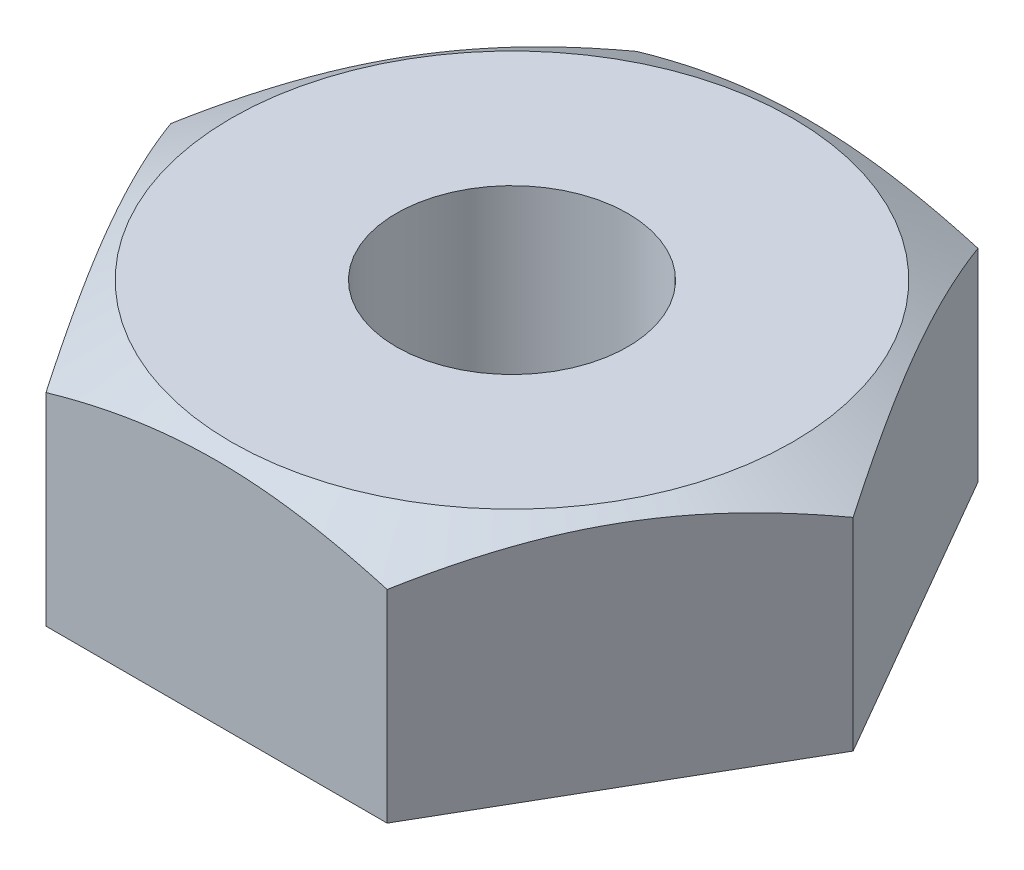
ISO-10303-21;
HEADER;
FILE_DESCRIPTION(('STEP AP214'),'2;1');
FILE_NAME('part.step','',(''),(''),'','','');
FILE_SCHEMA(('AUTOMOTIVE_DESIGN { 1 0 10303 214 1 1 1 1 }'));
ENDSEC;
DATA;
#1=APPLICATION_CONTEXT('core data for automotive mechanical design processes');
#2=APPLICATION_PROTOCOL_DEFINITION('international standard','automotive_design',2000,#1);
#3=PRODUCT_CONTEXT('',#1,'mechanical');
#4=PRODUCT('Part','Part','',(#3));
#5=PRODUCT_RELATED_PRODUCT_CATEGORY('part','',(#4));
#6=PRODUCT_DEFINITION_FORMATION('','',#4);
#7=PRODUCT_DEFINITION_CONTEXT('part definition',#1,'design');
#8=PRODUCT_DEFINITION('design','',#6,#7);
#9=PRODUCT_DEFINITION_SHAPE('','',#8);
#10=(LENGTH_UNIT() NAMED_UNIT(*) SI_UNIT(.MILLI.,.METRE.));
#11=(NAMED_UNIT(*) PLANE_ANGLE_UNIT() SI_UNIT($,.RADIAN.));
#12=(NAMED_UNIT(*) SI_UNIT($,.STERADIAN.) SOLID_ANGLE_UNIT());
#13=UNCERTAINTY_MEASURE_WITH_UNIT(LENGTH_MEASURE(1.E-05),#10,'distance_accuracy_value','');
#14=(GEOMETRIC_REPRESENTATION_CONTEXT(3) GLOBAL_UNCERTAINTY_ASSIGNED_CONTEXT((#13)) GLOBAL_UNIT_ASSIGNED_CONTEXT((#10,
#11,#12)) REPRESENTATION_CONTEXT('',''));
#15=CARTESIAN_POINT('',(0.,0.,0.));
#16=DIRECTION('',(0.,0.,1.));
#17=DIRECTION('',(1.,0.,0.));
#18=AXIS2_PLACEMENT_3D('',#15,#16,#17);
#19=CARTESIAN_POINT('',(-1.15,1.6,-1.99185842870421));
#20=DIRECTION('',(0.,1.,0.));
#21=DIRECTION('',(0.,0.,1.));
#22=AXIS2_PLACEMENT_3D('',#19,#20,#21);
#23=PLANE('',#22);
#24=CARTESIAN_POINT('',(0.,1.6,0.));
#25=DIRECTION('',(0.,1.,0.));
#26=DIRECTION('',(0.,0.,1.));
#27=AXIS2_PLACEMENT_3D('',#24,#25,#26);
#28=CIRCLE('',#27,0.78);
#29=CARTESIAN_POINT('',(0.,1.6,0.78));
#30=VERTEX_POINT('',#29);
#31=EDGE_CURVE('E133',#30,#30,#28,.T.);
#32=ORIENTED_EDGE('',*,*,#31,.F.);
#33=EDGE_LOOP('',(#32));
#34=FACE_BOUND('',#33,.T.);
#35=CARTESIAN_POINT('',(0.,1.6,0.));
#36=DIRECTION('',(0.,1.,0.));
#37=DIRECTION('',(0.,0.,1.));
#38=AXIS2_PLACEMENT_3D('',#35,#36,#37);
#39=CIRCLE('',#38,1.89185842870421);
#40=CARTESIAN_POINT('',(0.,1.6,1.89185842870421));
#41=VERTEX_POINT('',#40);
#42=EDGE_CURVE('E192',#41,#41,#39,.T.);
#43=ORIENTED_EDGE('',*,*,#42,.T.);
#44=EDGE_LOOP('',(#43));
#45=FACE_BOUND('',#44,.T.);
#46=ADVANCED_FACE('F35',(#34,#45),#23,.T.);
#47=CARTESIAN_POINT('',(-1.15,0.,-1.99185842870421));
#48=DIRECTION('',(0.,1.,0.));
#49=DIRECTION('',(0.,0.,1.));
#50=AXIS2_PLACEMENT_3D('',#47,#48,#49);
#51=PLANE('',#50);
#52=DIRECTION('',(-0.5,0.,0.866025403784439));
#53=VECTOR('',#52,1.);
#54=CARTESIAN_POINT('',(-1.15,0.,-1.99185842870421));
#55=LINE('',#54,#53);
#56=CARTESIAN_POINT('',(-1.15,0.,-1.99185842870421));
#57=VERTEX_POINT('',#56);
#58=CARTESIAN_POINT('',(-2.3,0.,0.));
#59=VERTEX_POINT('',#58);
#60=EDGE_CURVE('E128',#57,#59,#55,.T.);
#61=ORIENTED_EDGE('',*,*,#60,.F.);
#62=DIRECTION('',(1.,0.,0.));
#63=VECTOR('',#62,1.);
#64=CARTESIAN_POINT('',(-1.15,0.,-1.99185842870421));
#65=LINE('',#64,#63);
#66=CARTESIAN_POINT('',(1.15,0.,-1.99185842870421));
#67=VERTEX_POINT('',#66);
#68=EDGE_CURVE('E105',#57,#67,#65,.T.);
#69=ORIENTED_EDGE('',*,*,#68,.T.);
#70=DIRECTION('',(0.5,0.,0.866025403784439));
#71=VECTOR('',#70,1.);
#72=CARTESIAN_POINT('',(1.15,0.,-1.99185842870421));
#73=LINE('',#72,#71);
#74=CARTESIAN_POINT('',(2.3,0.,0.));
#75=VERTEX_POINT('',#74);
#76=EDGE_CURVE('E110',#67,#75,#73,.T.);
#77=ORIENTED_EDGE('',*,*,#76,.T.);
#78=DIRECTION('',(0.5,0.,-0.866025403784439));
#79=VECTOR('',#78,1.);
#80=CARTESIAN_POINT('',(1.15,0.,1.99185842870421));
#81=LINE('',#80,#79);
#82=CARTESIAN_POINT('',(1.15,0.,1.99185842870421));
#83=VERTEX_POINT('',#82);
#84=EDGE_CURVE('E140',#83,#75,#81,.T.);
#85=ORIENTED_EDGE('',*,*,#84,.F.);
#86=DIRECTION('',(1.,0.,0.));
#87=VECTOR('',#86,1.);
#88=CARTESIAN_POINT('',(-1.15,0.,1.99185842870421));
#89=LINE('',#88,#87);
#90=CARTESIAN_POINT('',(-1.15,0.,1.99185842870421));
#91=VERTEX_POINT('',#90);
#92=EDGE_CURVE('E131',#91,#83,#89,.T.);
#93=ORIENTED_EDGE('',*,*,#92,.F.);
#94=DIRECTION('',(0.5,0.,0.866025403784439));
#95=VECTOR('',#94,1.);
#96=CARTESIAN_POINT('',(-2.3,0.,0.));
#97=LINE('',#96,#95);
#98=EDGE_CURVE('E123',#59,#91,#97,.T.);
#99=ORIENTED_EDGE('',*,*,#98,.F.);
#100=EDGE_LOOP('',(#61,#69,#77,#85,#93,#99));
#101=FACE_BOUND('',#100,.T.);
#102=CARTESIAN_POINT('',(0.,0.,0.));
#103=DIRECTION('',(0.,1.,0.));
#104=DIRECTION('',(0.,0.,1.));
#105=AXIS2_PLACEMENT_3D('',#102,#103,#104);
#106=CIRCLE('',#105,0.78);
#107=CARTESIAN_POINT('',(0.,0.,0.78));
#108=VERTEX_POINT('',#107);
#109=EDGE_CURVE('E99',#108,#108,#106,.T.);
#110=ORIENTED_EDGE('',*,*,#109,.T.);
#111=EDGE_LOOP('',(#110));
#112=FACE_BOUND('',#111,.T.);
#113=ADVANCED_FACE('F126',(#101,#112),#51,.F.);
#114=CARTESIAN_POINT('',(-1.15,1.6,-1.99185842870421));
#115=DIRECTION('',(0.866025403784439,0.,0.5));
#116=DIRECTION('',(0.5,0.,-0.866025403784439));
#117=AXIS2_PLACEMENT_3D('',#114,#115,#116);
#118=PLANE('',#117);
#119=CARTESIAN_POINT('',(-1.14988452994616,1.36429268225805,-1.99205842870421));
#120=CARTESIAN_POINT('',(-1.20042201404731,1.39348332062328,-1.90452493855432));
#121=CARTESIAN_POINT('',(-1.25139573268659,1.4200315147721,-1.81623586802035));
#122=CARTESIAN_POINT('',(-1.35422590464177,1.46637250974531,-1.63812878564294));
#123=CARTESIAN_POINT('',(-1.40608418563277,1.4861489153513,-1.54830760817336));
#124=CARTESIAN_POINT('',(-1.50915803540786,1.51693494262689,-1.36977846343118));
#125=CARTESIAN_POINT('',(-1.56035774146638,1.52814944173253,-1.28109797120522));
#126=CARTESIAN_POINT('',(-1.66299816846908,1.54153924942266,-1.10331953672598));
#127=CARTESIAN_POINT('',(-1.71443851613463,1.54372564377741,-1.01422224101025));
#128=CARTESIAN_POINT('',(-1.81056450684164,1.53918659944931,-0.847727141177814));
#129=CARTESIAN_POINT('',(-1.85526451129334,1.53357565295512,-0.770304462368917));
#130=CARTESIAN_POINT('',(-1.94437328836741,1.51578932039895,-0.615963533076291));
#131=CARTESIAN_POINT('',(-1.98878175258729,1.50360785359755,-0.539045816761362));
#132=CARTESIAN_POINT('',(-2.0780743795485,1.47315397801893,-0.384386450123253));
#133=CARTESIAN_POINT('',(-2.12294723605458,1.45475242630936,-0.306664382773971));
#134=CARTESIAN_POINT('',(-2.21202353126742,1.41298769854759,-0.152379713715318));
#135=CARTESIAN_POINT('',(-2.25622811191627,1.38963434110104,-0.0758151341042413));
#136=CARTESIAN_POINT('',(-2.30011547005384,1.36429268225805,0.000200000000000194));
#137=B_SPLINE_CURVE_WITH_KNOTS('',3,(#119,#120,#121,#122,#123,#124,#125,#126,#127,#128,#129,
#130,#131,#132,#133,#134,#135,#136),.UNSPECIFIED.,.F.,.F.,(4,2,2,2,2,2,2,2,4),(0.,
0.31574132047016,0.632241766796059,0.940908265501738,1.24919563421224,1.51766778517113,
1.78638882315088,2.06107195968261,2.33521545509652),.UNSPECIFIED.);
#138=CARTESIAN_POINT('',(-1.15000000000014,1.36435935394499,-1.99185842870421));
#139=VERTEX_POINT('',#138);
#140=CARTESIAN_POINT('',(-2.3,1.3643593539449,0.));
#141=VERTEX_POINT('',#140);
#142=EDGE_CURVE('E94',#139,#141,#137,.T.);
#143=ORIENTED_EDGE('',*,*,#142,.F.);
#144=DIRECTION('',(0.,-1.,0.));
#145=VECTOR('',#144,1.);
#146=CARTESIAN_POINT('',(-1.15,1.6,-1.99185842870421));
#147=LINE('',#146,#145);
#148=EDGE_CURVE('E64',#139,#57,#147,.T.);
#149=ORIENTED_EDGE('',*,*,#148,.T.);
#150=ORIENTED_EDGE('',*,*,#60,.T.);
#151=DIRECTION('',(0.,-1.,0.));
#152=VECTOR('',#151,1.);
#153=CARTESIAN_POINT('',(-2.3,1.6,0.));
#154=LINE('',#153,#152);
#155=EDGE_CURVE('E50',#141,#59,#154,.T.);
#156=ORIENTED_EDGE('',*,*,#155,.F.);
#157=EDGE_LOOP('',(#143,#149,#150,#156));
#158=FACE_BOUND('',#157,.T.);
#159=ADVANCED_FACE('F37',(#158),#118,.F.);
#160=CARTESIAN_POINT('',(-2.3,1.6,0.));
#161=DIRECTION('',(0.866025403784439,0.,-0.5));
#162=DIRECTION('',(-0.5,0.,-0.866025403784439));
#163=AXIS2_PLACEMENT_3D('',#160,#161,#162);
#164=PLANE('',#163);
#165=CARTESIAN_POINT('',(-2.30011547005384,1.36429268225805,-0.000200000000000038));
#166=CARTESIAN_POINT('',(-2.24957798595269,1.39348332062328,0.0873334901498878));
#167=CARTESIAN_POINT('',(-2.1986042673134,1.4200315147721,0.175622560683855));
#168=CARTESIAN_POINT('',(-2.09577409535823,1.46637250974531,0.353729643061264));
#169=CARTESIAN_POINT('',(-2.04391581436723,1.4861489153513,0.443550820530852));
#170=CARTESIAN_POINT('',(-1.94084196459214,1.51693494262689,0.622079965273031));
#171=CARTESIAN_POINT('',(-1.88964225853362,1.52814944173253,0.710760457498986));
#172=CARTESIAN_POINT('',(-1.78700183153092,1.54153924942266,0.888538891978229));
#173=CARTESIAN_POINT('',(-1.73556148386537,1.54372564377741,0.977636187693961));
#174=CARTESIAN_POINT('',(-1.63943549315836,1.53918659944931,1.1441312875264));
#175=CARTESIAN_POINT('',(-1.59473548870666,1.53357565295512,1.22155396633529));
#176=CARTESIAN_POINT('',(-1.50562671163259,1.51578932039895,1.37589489562792));
#177=CARTESIAN_POINT('',(-1.46121824741271,1.50360785359755,1.45281261194285));
#178=CARTESIAN_POINT('',(-1.3719256204515,1.47315397801893,1.60747197858096));
#179=CARTESIAN_POINT('',(-1.32705276394542,1.45475242630936,1.68519404593024));
#180=CARTESIAN_POINT('',(-1.23797646873258,1.41298769854759,1.83947871498889));
#181=CARTESIAN_POINT('',(-1.19377188808373,1.38963434110104,1.91604329459997));
#182=CARTESIAN_POINT('',(-1.14988452994616,1.36429268225805,1.99205842870421));
#183=B_SPLINE_CURVE_WITH_KNOTS('',3,(#165,#166,#167,#168,#169,#170,#171,#172,#173,#174,#175,
#176,#177,#178,#179,#180,#181,#182),.UNSPECIFIED.,.F.,.F.,(4,2,2,2,2,2,2,2,4),(0.,
0.31574132047016,0.632241766796059,0.940908265501737,1.24919563421224,1.51766778517113,
1.78638882315088,2.06107195968261,2.33521545509652),.UNSPECIFIED.);
#184=CARTESIAN_POINT('',(-1.15000000000014,1.36435935394499,1.99185842870421));
#185=VERTEX_POINT('',#184);
#186=EDGE_CURVE('E100',#141,#185,#183,.T.);
#187=ORIENTED_EDGE('',*,*,#186,.F.);
#188=ORIENTED_EDGE('',*,*,#155,.T.);
#189=ORIENTED_EDGE('',*,*,#98,.T.);
#190=DIRECTION('',(0.,-1.,0.));
#191=VECTOR('',#190,1.);
#192=CARTESIAN_POINT('',(-1.15,1.6,1.99185842870421));
#193=LINE('',#192,#191);
#194=EDGE_CURVE('E117',#185,#91,#193,.T.);
#195=ORIENTED_EDGE('',*,*,#194,.F.);
#196=EDGE_LOOP('',(#187,#188,#189,#195));
#197=FACE_BOUND('',#196,.T.);
#198=ADVANCED_FACE('F121',(#197),#164,.F.);
#199=CARTESIAN_POINT('',(-1.15,1.6,1.99185842870421));
#200=DIRECTION('',(0.,0.,-1.));
#201=DIRECTION('',(-1.,0.,0.));
#202=AXIS2_PLACEMENT_3D('',#199,#200,#201);
#203=PLANE('',#202);
#204=CARTESIAN_POINT('',(-3.12080119478287,0.554750832982927,1.99185842870421));
#205=CARTESIAN_POINT('',(-3.03351754308818,0.59721796523468,1.99185842870421));
#206=CARTESIAN_POINT('',(-2.94603687511764,0.639286937122216,1.99185842870421));
#207=CARTESIAN_POINT('',(-2.77057682529796,0.722405196992155,1.99185842870421));
#208=CARTESIAN_POINT('',(-2.68259737019887,0.763454330176871,1.99185842870421));
#209=CARTESIAN_POINT('',(-2.50559700282272,0.844509236699711,1.99185842870421));
#210=CARTESIAN_POINT('',(-2.41657304659031,0.884508385330449,1.99185842870421));
#211=CARTESIAN_POINT('',(-2.23782792728811,0.962911232442809,1.99185842870421));
#212=CARTESIAN_POINT('',(-2.1481067965103,1.00131500430292,1.99185842870421));
#213=CARTESIAN_POINT('',(-1.96483016383242,1.07734914865354,1.99185842870421));
#214=CARTESIAN_POINT('',(-1.87124628043799,1.11491147435415,1.99185842870421));
#215=CARTESIAN_POINT('',(-1.68301408331416,1.18726186615693,1.99185842870421));
#216=CARTESIAN_POINT('',(-1.58836586418859,1.22205017663884,1.99185842870421));
#217=CARTESIAN_POINT('',(-1.39799370127081,1.28797439555425,1.99185842870421));
#218=CARTESIAN_POINT('',(-1.30227212547874,1.31911707486884,1.99185842870421));
#219=CARTESIAN_POINT('',(-1.10945636504811,1.37676796421405,1.99185842870421));
#220=CARTESIAN_POINT('',(-1.01236261267466,1.40327760006435,1.99185842870421));
#221=CARTESIAN_POINT('',(-0.81727681169094,1.45027229479769,1.99185842870421));
#222=CARTESIAN_POINT('',(-0.719292835149829,1.47079025059494,1.99185842870421));
#223=CARTESIAN_POINT('',(-0.522074820204522,1.50466008927365,1.99185842870421));
#224=CARTESIAN_POINT('',(-0.422840915777331,1.51801273361055,1.99185842870421));
#225=CARTESIAN_POINT('',(-0.224924058457588,1.53630998112006,1.99185842870421));
#226=CARTESIAN_POINT('',(-0.126251629182585,1.54136518946869,1.99185842870421));
#227=CARTESIAN_POINT('',(0.0711600694134036,1.54294483391463,1.99185842870421));
#228=CARTESIAN_POINT('',(0.169899340072573,1.53946909384771,1.99185842870421));
#229=CARTESIAN_POINT('',(0.404855559971128,1.52134650880672,1.99185842870421));
#230=CARTESIAN_POINT('',(0.540781520095862,1.50289553112564,1.99185842870421));
#231=CARTESIAN_POINT('',(0.810219177211249,1.45297204997533,1.99185842870421));
#232=CARTESIAN_POINT('',(0.94372853871094,1.42148758562842,1.99185842870421));
#233=CARTESIAN_POINT('',(1.21115474990294,1.34811639629353,1.99185842870421));
#234=CARTESIAN_POINT('',(1.34500791208022,1.30600331720994,1.99185842870421));
#235=CARTESIAN_POINT('',(1.54391268643831,1.23757692933059,1.99185842870421));
#236=CARTESIAN_POINT('',(1.60989647657069,1.21389415155641,1.99185842870421));
#237=CARTESIAN_POINT('',(1.74131488093355,1.16505112811007,1.99185842870421));
#238=CARTESIAN_POINT('',(1.80674950744973,1.13989091559184,1.99185842870421));
#239=CARTESIAN_POINT('',(1.98250058512648,1.07040363315556,1.99185842870421));
#240=CARTESIAN_POINT('',(2.09236003894865,1.02492346785297,1.99185842870421));
#241=CARTESIAN_POINT('',(2.31095661028843,0.931332008787043,1.99185842870421));
#242=CARTESIAN_POINT('',(2.41969360894964,0.883220439714638,1.99185842870421));
#243=CARTESIAN_POINT('',(2.63629946600094,0.784991168221169,1.99185842870421));
#244=CARTESIAN_POINT('',(2.7441680143349,0.734872784421599,1.99185842870421));
#245=CARTESIAN_POINT('',(2.95917978643202,0.633100753683133,1.99185842870421));
#246=CARTESIAN_POINT('',(3.0663229885175,0.581447061106535,1.99185842870421));
#247=CARTESIAN_POINT('',(3.38720962944191,0.424546687127184,1.99185842870421));
#248=CARTESIAN_POINT('',(3.60007854320113,0.31751379798323,1.99185842870421));
#249=CARTESIAN_POINT('',(4.02422198293497,0.100462733123772,1.99185842870421));
#250=CARTESIAN_POINT('',(4.23549682622387,-0.00955482729448208,1.99185842870421));
#251=CARTESIAN_POINT('',(4.63478365549657,-0.219939013724351,1.99185842870421));
#252=CARTESIAN_POINT('',(4.82290298815183,-0.320102254665521,1.99185842870421));
#253=CARTESIAN_POINT('',(5.19851394322352,-0.52162395926336,1.99185842870421));
#254=CARTESIAN_POINT('',(5.386005527029,-0.622982494765984,1.99185842870421));
#255=CARTESIAN_POINT('',(5.75989007690988,-0.826251501438286,1.99185842870421));
#256=CARTESIAN_POINT('',(5.9462846280993,-0.928159060431567,1.99185842870421));
#257=CARTESIAN_POINT('',(6.31868177506407,-1.1326540760696,1.99185842870421));
#258=CARTESIAN_POINT('',(6.50468440005595,-1.2352414794878,1.99185842870421));
#259=CARTESIAN_POINT('',(6.6905492562791,-1.33807617669344,1.99185842870421));
#260=B_SPLINE_CURVE_WITH_KNOTS('',3,(#204,#205,#206,#207,#208,#209,#210,#211,#212,#213,#214,
#215,#216,#217,#218,#219,#220,#221,#222,#223,#224,#225,#226,#227,#228,#229,#230,#231,#232,#233,
#234,#235,#236,#237,#238,#239,#240,#241,#242,#243,#244,#245,#246,#247,#248,#249,#250,#251,#252,
#253,#254,#255,#256,#257,#258,#259),.UNSPECIFIED.,.F.,.F.,(4,2,2,2,2,2,2,2,2,2,2,2,2,2,2,2,2,2,
2,2,2,2,2,2,2,2,2,4),(0.,0.29120272046053,0.582449374791217,0.875228164916136,1.16799347389631,
1.4704820929471,1.77294403444131,2.07483500076373,2.37663289587511,2.6767412167312,
2.97681763884969,3.27286054775142,3.56890956999604,3.97958099446601,4.3906301320102,
4.81130614472314,5.02160984072814,5.23190881927967,5.58856299221239,5.94525455152332,
6.30206826352466,6.65889259259221,7.37363654794246,8.08823426028575,8.72759837551432,
9.3670011190975,10.0043006509509,10.6415508631808),.UNSPECIFIED.);
#261=CARTESIAN_POINT('',(1.15,1.3643593539449,1.99185842870421));
#262=VERTEX_POINT('',#261);
#263=EDGE_CURVE('E155',#185,#262,#260,.T.);
#264=ORIENTED_EDGE('',*,*,#263,.F.);
#265=ORIENTED_EDGE('',*,*,#194,.T.);
#266=ORIENTED_EDGE('',*,*,#92,.T.);
#267=DIRECTION('',(0.,-1.,0.));
#268=VECTOR('',#267,1.);
#269=CARTESIAN_POINT('',(1.15,1.6,1.99185842870421));
#270=LINE('',#269,#268);
#271=EDGE_CURVE('E115',#262,#83,#270,.T.);
#272=ORIENTED_EDGE('',*,*,#271,.F.);
#273=EDGE_LOOP('',(#264,#265,#266,#272));
#274=FACE_BOUND('',#273,.T.);
#275=ADVANCED_FACE('F154',(#274),#203,.F.);
#276=CARTESIAN_POINT('',(1.15,1.6,1.99185842870421));
#277=DIRECTION('',(-0.866025403784439,0.,-0.5));
#278=DIRECTION('',(-0.5,0.,0.866025403784439));
#279=AXIS2_PLACEMENT_3D('',#276,#277,#278);
#280=PLANE('',#279);
#281=CARTESIAN_POINT('',(1.14988452994616,1.36429268225805,1.99205842870421));
#282=CARTESIAN_POINT('',(1.20042201404731,1.39348332062328,1.90452493855432));
#283=CARTESIAN_POINT('',(1.25139573268659,1.4200315147721,1.81623586802035));
#284=CARTESIAN_POINT('',(1.35422590464177,1.46637250974531,1.63812878564294));
#285=CARTESIAN_POINT('',(1.40608418563277,1.4861489153513,1.54830760817336));
#286=CARTESIAN_POINT('',(1.50915803540786,1.51693494262689,1.36977846343118));
#287=CARTESIAN_POINT('',(1.56035774146638,1.52814944173254,1.28109797120522));
#288=CARTESIAN_POINT('',(1.66299816846908,1.54153924942266,1.10331953672598));
#289=CARTESIAN_POINT('',(1.71443851613463,1.54372564377741,1.01422224101025));
#290=CARTESIAN_POINT('',(1.81056450684164,1.53918659944931,0.847727141177814));
#291=CARTESIAN_POINT('',(1.85526451129334,1.53357565295512,0.770304462368917));
#292=CARTESIAN_POINT('',(1.94437328836741,1.51578932039895,0.615963533076291));
#293=CARTESIAN_POINT('',(1.98878175258729,1.50360785359755,0.539045816761362));
#294=CARTESIAN_POINT('',(2.0780743795485,1.47315397801893,0.384386450123253));
#295=CARTESIAN_POINT('',(2.12294723605458,1.45475242630936,0.30666438277397));
#296=CARTESIAN_POINT('',(2.21202353126742,1.41298769854759,0.152379713715318));
#297=CARTESIAN_POINT('',(2.25622811191627,1.38963434110104,0.075815134104241));
#298=CARTESIAN_POINT('',(2.30011547005384,1.36429268225805,-0.000200000000000165));
#299=B_SPLINE_CURVE_WITH_KNOTS('',3,(#281,#282,#283,#284,#285,#286,#287,#288,#289,#290,#291,
#292,#293,#294,#295,#296,#297,#298),.UNSPECIFIED.,.F.,.F.,(4,2,2,2,2,2,2,2,4),(0.,
0.31574132047016,0.632241766796059,0.940908265501738,1.24919563421224,1.51766778517113,
1.78638882315088,2.06107195968261,2.33521545509652),.UNSPECIFIED.);
#300=CARTESIAN_POINT('',(2.3,1.3643593539449,0.));
#301=VERTEX_POINT('',#300);
#302=EDGE_CURVE('E151',#262,#301,#299,.T.);
#303=ORIENTED_EDGE('',*,*,#302,.F.);
#304=ORIENTED_EDGE('',*,*,#271,.T.);
#305=ORIENTED_EDGE('',*,*,#84,.T.);
#306=DIRECTION('',(0.,-1.,0.));
#307=VECTOR('',#306,1.);
#308=CARTESIAN_POINT('',(2.3,1.6,0.));
#309=LINE('',#308,#307);
#310=EDGE_CURVE('E108',#301,#75,#309,.T.);
#311=ORIENTED_EDGE('',*,*,#310,.F.);
#312=EDGE_LOOP('',(#303,#304,#305,#311));
#313=FACE_BOUND('',#312,.T.);
#314=ADVANCED_FACE('F149',(#313),#280,.F.);
#315=CARTESIAN_POINT('',(1.15,1.6,-1.99185842870421));
#316=DIRECTION('',(0.866025403784439,0.,-0.5));
#317=DIRECTION('',(-0.5,0.,-0.866025403784439));
#318=AXIS2_PLACEMENT_3D('',#315,#316,#317);
#319=PLANE('',#318);
#320=DIRECTION('',(0.,-1.,0.));
#321=VECTOR('',#320,1.);
#322=CARTESIAN_POINT('',(1.15,1.6,-1.99185842870421));
#323=LINE('',#322,#321);
#324=CARTESIAN_POINT('',(1.15,1.3643593539449,-1.99185842870421));
#325=VERTEX_POINT('',#324);
#326=EDGE_CURVE('E106',#325,#67,#323,.T.);
#327=ORIENTED_EDGE('',*,*,#326,.F.);
#328=CARTESIAN_POINT('',(1.14988452994616,1.36429268225805,-1.99205842870421));
#329=CARTESIAN_POINT('',(1.20042201404731,1.39348332062328,-1.90452493855432));
#330=CARTESIAN_POINT('',(1.25139573268659,1.4200315147721,-1.81623586802035));
#331=CARTESIAN_POINT('',(1.35422590464177,1.46637250974531,-1.63812878564294));
#332=CARTESIAN_POINT('',(1.40608418563277,1.4861489153513,-1.54830760817336));
#333=CARTESIAN_POINT('',(1.50915803540786,1.51693494262689,-1.36977846343118));
#334=CARTESIAN_POINT('',(1.56035774146638,1.52814944173253,-1.28109797120522));
#335=CARTESIAN_POINT('',(1.66299816846908,1.54153924942266,-1.10331953672598));
#336=CARTESIAN_POINT('',(1.71443851613463,1.54372564377741,-1.01422224101025));
#337=CARTESIAN_POINT('',(1.81056450684164,1.53918659944931,-0.847727141177814));
#338=CARTESIAN_POINT('',(1.85526451129334,1.53357565295512,-0.770304462368917));
#339=CARTESIAN_POINT('',(1.94437328836741,1.51578932039895,-0.615963533076291));
#340=CARTESIAN_POINT('',(1.98878175258729,1.50360785359755,-0.539045816761362));
#341=CARTESIAN_POINT('',(2.0780743795485,1.47315397801893,-0.384386450123253));
#342=CARTESIAN_POINT('',(2.12294723605458,1.45475242630936,-0.306664382773971));
#343=CARTESIAN_POINT('',(2.21202353126742,1.41298769854759,-0.152379713715318));
#344=CARTESIAN_POINT('',(2.25622811191627,1.38963434110104,-0.0758151341042413));
#345=CARTESIAN_POINT('',(2.30011547005384,1.36429268225805,0.000200000000000194));
#346=B_SPLINE_CURVE_WITH_KNOTS('',3,(#328,#329,#330,#331,#332,#333,#334,#335,#336,#337,#338,
#339,#340,#341,#342,#343,#344,#345),.UNSPECIFIED.,.F.,.F.,(4,2,2,2,2,2,2,2,4),(0.,
0.31574132047016,0.632241766796059,0.940908265501738,1.24919563421224,1.51766778517113,
1.78638882315088,2.06107195968261,2.33521545509652),.UNSPECIFIED.);
#347=EDGE_CURVE('E57',#325,#301,#346,.T.);
#348=ORIENTED_EDGE('',*,*,#347,.T.);
#349=ORIENTED_EDGE('',*,*,#310,.T.);
#350=ORIENTED_EDGE('',*,*,#76,.F.);
#351=EDGE_LOOP('',(#327,#348,#349,#350));
#352=FACE_BOUND('',#351,.T.);
#353=ADVANCED_FACE('F145',(#352),#319,.T.);
#354=CARTESIAN_POINT('',(-1.15,1.6,-1.99185842870421));
#355=DIRECTION('',(0.,0.,-1.));
#356=DIRECTION('',(-1.,0.,0.));
#357=AXIS2_PLACEMENT_3D('',#354,#355,#356);
#358=PLANE('',#357);
#359=ORIENTED_EDGE('',*,*,#148,.F.);
#360=CARTESIAN_POINT('',(-3.12080119396281,0.554750833382024,-1.99185842870421));
#361=CARTESIAN_POINT('',(-3.03351754229573,0.597217965617119,-1.99185842870421));
#362=CARTESIAN_POINT('',(-2.94603687435281,0.639286937488007,-1.99185842870421));
#363=CARTESIAN_POINT('',(-2.77057682458845,0.722405197324728,-1.99185842870421));
#364=CARTESIAN_POINT('',(-2.68259736951707,0.763454330492876,-1.99185842870421));
#365=CARTESIAN_POINT('',(-2.50559700219676,0.844509236982568,-1.99185842870421));
#366=CARTESIAN_POINT('',(-2.41657304599248,0.884508385596731,-1.99185842870421));
#367=CARTESIAN_POINT('',(-2.23782792674673,0.962911232676214,-1.99185842870421));
#368=CARTESIAN_POINT('',(-2.14810679599724,1.00131500452002,-1.99185842870421));
#369=CARTESIAN_POINT('',(-1.96483016337819,1.07734914883758,-1.99185842870421));
#370=CARTESIAN_POINT('',(-1.87124628001428,1.11491147452147,-1.99185842870421));
#371=CARTESIAN_POINT('',(-1.68301408295197,1.18726186629169,-1.99185842870421));
#372=CARTESIAN_POINT('',(-1.5883658638574,1.22205017675777,-1.99185842870421));
#373=CARTESIAN_POINT('',(-1.39799370100219,1.28797439564303,-1.99185842870421));
#374=CARTESIAN_POINT('',(-1.3022721252417,1.3191170749433,-1.99185842870421));
#375=CARTESIAN_POINT('',(-1.10945636487508,1.3767679642622,-1.99185842870421));
#376=CARTESIAN_POINT('',(-1.01236261253407,1.40327760010051,-1.99185842870421));
#377=CARTESIAN_POINT('',(-0.817276811631863,1.45027229480965,-1.99185842870421));
#378=CARTESIAN_POINT('',(-0.719292835140057,1.47079025059561,-1.99185842870421));
#379=CARTESIAN_POINT('',(-0.522074820294551,1.50466008925919,-1.99185842870421));
#380=CARTESIAN_POINT('',(-0.422840915917855,1.51801273359224,-1.99185842870421));
#381=CARTESIAN_POINT('',(-0.224924058698273,1.53630998110304,-1.99185842870421));
#382=CARTESIAN_POINT('',(-0.126251629472926,1.54136518945666,-1.99185842870421));
#383=CARTESIAN_POINT('',(0.0711600690245141,1.54294483392124,-1.99185842870421));
#384=CARTESIAN_POINT('',(0.16989933963479,1.53946909386797,-1.99185842870421));
#385=CARTESIAN_POINT('',(0.404855559458593,1.52134650886491,-1.99185842870421));
#386=CARTESIAN_POINT('',(0.540781519557922,1.50289553120674,-1.99185842870421));
#387=CARTESIAN_POINT('',(0.810219176624416,1.45297205010279,-1.99185842870421));
#388=CARTESIAN_POINT('',(0.943728538100621,1.42148758577935,-1.99185842870421));
#389=CARTESIAN_POINT('',(1.21115474924541,1.34811639649087,-1.99185842870421));
#390=CARTESIAN_POINT('',(1.34500791139898,1.30600331743024,-1.99185842870421));
#391=CARTESIAN_POINT('',(1.54391268572169,1.23757692958412,-1.99185842870421));
#392=CARTESIAN_POINT('',(1.60989647584233,1.2138941518208,-1.99185842870421));
#393=CARTESIAN_POINT('',(1.74131488018169,1.16505112839583,-1.99185842870421));
#394=CARTESIAN_POINT('',(1.80674950668613,1.13989091588809,-1.99185842870421));
#395=CARTESIAN_POINT('',(1.98250058435617,1.07040363346975,-1.99185842870421));
#396=CARTESIAN_POINT('',(2.09236003818304,1.02492346817348,-1.99185842870421));
#397=CARTESIAN_POINT('',(2.31095660953161,0.931332009118349,-1.99185842870421));
#398=CARTESIAN_POINT('',(2.41969360819691,0.883220440050425,-1.99185842870421));
#399=CARTESIAN_POINT('',(2.63629946525595,0.784991168564591,-1.99185842870421));
#400=CARTESIAN_POINT('',(2.74416801359356,0.734872784768173,-1.99185842870421));
#401=CARTESIAN_POINT('',(2.9591797856976,0.633100754035065,-1.99185842870421));
#402=CARTESIAN_POINT('',(3.06632298778634,0.581447061460674,-1.99185842870421));
#403=CARTESIAN_POINT('',(3.3872096287205,0.42454668748674,-1.99185842870421));
#404=CARTESIAN_POINT('',(3.60007854248576,0.317513798344966,-1.99185842870421));
#405=CARTESIAN_POINT('',(4.02422198223088,0.10046273348839,-1.99185842870421));
#406=CARTESIAN_POINT('',(4.23549682552502,-0.00955482692916064,-1.99185842870421));
#407=CARTESIAN_POINT('',(4.63478365480284,-0.219939013356243,-1.99185842870421));
#408=CARTESIAN_POINT('',(4.82290298745805,-0.320102254295201,-1.99185842870421));
#409=CARTESIAN_POINT('',(5.19851394252941,-0.521623958889058,-1.99185842870421));
#410=CARTESIAN_POINT('',(5.38600552633463,-0.622982494389912,-1.99185842870421));
#411=CARTESIAN_POINT('',(5.7598900762141,-0.82625150105858,-1.99185842870421));
#412=CARTESIAN_POINT('',(5.94628462740239,-0.928159060049994,-1.99185842870421));
#413=CARTESIAN_POINT('',(6.31868177436476,-1.13265407568449,-1.99185842870421));
#414=CARTESIAN_POINT('',(6.50468439935537,-1.23524147910102,-1.99185842870421));
#415=CARTESIAN_POINT('',(6.69054925557722,-1.33807617630506,-1.99185842870421));
#416=B_SPLINE_CURVE_WITH_KNOTS('',3,(#360,#361,#362,#363,#364,#365,#366,#367,#368,#369,#370,
#371,#372,#373,#374,#375,#376,#377,#378,#379,#380,#381,#382,#383,#384,#385,#386,#387,#388,#389,
#390,#391,#392,#393,#394,#395,#396,#397,#398,#399,#400,#401,#402,#403,#404,#405,#406,#407,#408,
#409,#410,#411,#412,#413,#414,#415),.UNSPECIFIED.,.F.,.F.,(4,2,2,2,2,2,2,2,2,2,2,2,2,2,2,2,2,2,
2,2,2,2,2,2,2,2,2,4),(0.,0.291202720364205,0.582449374598552,0.875228164626111,1.16799347350893,
1.47048209245607,1.77294403384664,2.07483500006573,2.37663289507387,2.67674121577856,
2.97681763774588,3.27286054650018,3.5689095685973,3.97958099298261,4.39063013044193,
4.81130614306622,5.02160983902704,5.23190881753437,5.58856299047279,5.94525454978947,
6.30206826179674,6.65889259087023,7.37363654623366,8.08823425858994,8.72759837381522,
9.36700111739518,10.0043006492429,10.641550861467),.UNSPECIFIED.);
#417=EDGE_CURVE('E11',#139,#325,#416,.T.);
#418=ORIENTED_EDGE('',*,*,#417,.T.);
#419=ORIENTED_EDGE('',*,*,#326,.T.);
#420=ORIENTED_EDGE('',*,*,#68,.F.);
#421=EDGE_LOOP('',(#359,#418,#419,#420));
#422=FACE_BOUND('',#421,.T.);
#423=ADVANCED_FACE('F103',(#422),#358,.T.);
#424=CARTESIAN_POINT('',(0.,1.6,0.));
#425=DIRECTION('',(0.,-1.,0.));
#426=DIRECTION('',(0.,0.,-1.));
#427=AXIS2_PLACEMENT_3D('',#424,#425,#426);
#428=CYLINDRICAL_SURFACE('',#427,0.78);
#429=ORIENTED_EDGE('',*,*,#31,.T.);
#430=EDGE_LOOP('',(#429));
#431=FACE_BOUND('',#430,.T.);
#432=ORIENTED_EDGE('',*,*,#109,.F.);
#433=EDGE_LOOP('',(#432));
#434=FACE_BOUND('',#433,.T.);
#435=ADVANCED_FACE('F178',(#431,#434),#428,.F.);
#436=CARTESIAN_POINT('',(0.,1.6,0.));
#437=DIRECTION('',(0.,-1.,0.));
#438=DIRECTION('',(0.,0.,1.));
#439=AXIS2_PLACEMENT_3D('',#436,#437,#438);
#440=CONICAL_SURFACE('',#439,1.89185842870421,1.0471975511966);
#441=ORIENTED_EDGE('',*,*,#42,.F.);
#442=EDGE_LOOP('',(#441));
#443=FACE_BOUND('',#442,.T.);
#444=ORIENTED_EDGE('',*,*,#417,.F.);
#445=ORIENTED_EDGE('',*,*,#142,.T.);
#446=ORIENTED_EDGE('',*,*,#186,.T.);
#447=ORIENTED_EDGE('',*,*,#263,.T.);
#448=ORIENTED_EDGE('',*,*,#302,.T.);
#449=ORIENTED_EDGE('',*,*,#347,.F.);
#450=EDGE_LOOP('',(#444,#445,#446,#447,#448,#449));
#451=FACE_BOUND('',#450,.T.);
#452=ADVANCED_FACE('F93',(#443,#451),#440,.T.);
#453=CLOSED_SHELL('',(#46,#113,#159,#198,#275,#314,#353,#423,#435,#452));
#454=MANIFOLD_SOLID_BREP('B2',#453);
#455=ADVANCED_BREP_SHAPE_REPRESENTATION('',(#18,#454),#14);
#456=SHAPE_DEFINITION_REPRESENTATION(#9,#455);
ENDSEC;
END-ISO-10303-21;
